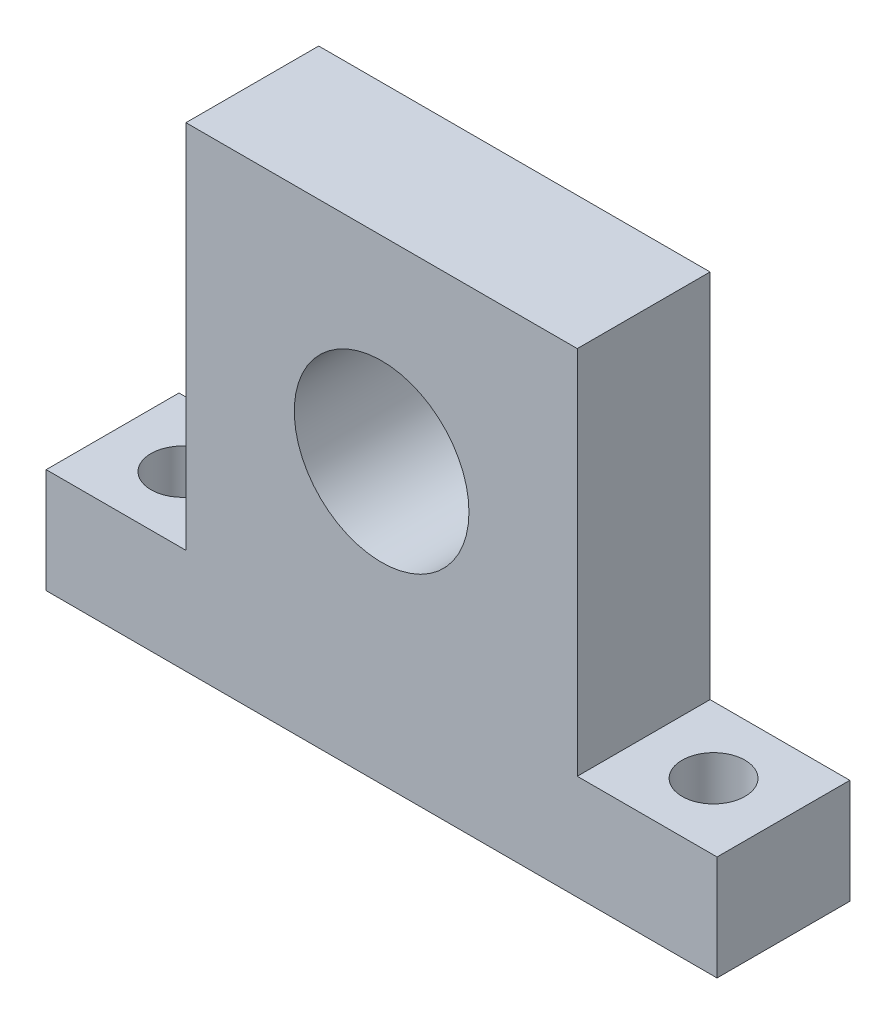
ISO-10303-21;
HEADER;
FILE_DESCRIPTION(('STEP AP214'),'2;1');
FILE_NAME('part.step','',(''),(''),'','','');
FILE_SCHEMA(('AUTOMOTIVE_DESIGN { 1 0 10303 214 1 1 1 1 }'));
ENDSEC;
DATA;
#1=APPLICATION_CONTEXT('core data for automotive mechanical design processes');
#2=APPLICATION_PROTOCOL_DEFINITION('international standard','automotive_design',2000,#1);
#3=PRODUCT_CONTEXT('',#1,'mechanical');
#4=PRODUCT('Part','Part','',(#3));
#5=PRODUCT_RELATED_PRODUCT_CATEGORY('part','',(#4));
#6=PRODUCT_DEFINITION_FORMATION('','',#4);
#7=PRODUCT_DEFINITION_CONTEXT('part definition',#1,'design');
#8=PRODUCT_DEFINITION('design','',#6,#7);
#9=PRODUCT_DEFINITION_SHAPE('','',#8);
#10=(LENGTH_UNIT() NAMED_UNIT(*) SI_UNIT(.MILLI.,.METRE.));
#11=(NAMED_UNIT(*) PLANE_ANGLE_UNIT() SI_UNIT($,.RADIAN.));
#12=(NAMED_UNIT(*) SI_UNIT($,.STERADIAN.) SOLID_ANGLE_UNIT());
#13=UNCERTAINTY_MEASURE_WITH_UNIT(LENGTH_MEASURE(1.E-05),#10,'distance_accuracy_value','');
#14=(GEOMETRIC_REPRESENTATION_CONTEXT(3) GLOBAL_UNCERTAINTY_ASSIGNED_CONTEXT((#13)) GLOBAL_UNIT_ASSIGNED_CONTEXT((#10,
#11,#12)) REPRESENTATION_CONTEXT('',''));
#15=CARTESIAN_POINT('',(0.,0.,0.));
#16=DIRECTION('',(0.,0.,1.));
#17=DIRECTION('',(1.,0.,0.));
#18=AXIS2_PLACEMENT_3D('',#15,#16,#17);
#19=CARTESIAN_POINT('',(0.,0.,19.));
#20=DIRECTION('',(0.,0.,1.));
#21=DIRECTION('',(1.,0.,0.));
#22=AXIS2_PLACEMENT_3D('',#19,#20,#21);
#23=PLANE('',#22);
#24=DIRECTION('',(1.,0.,0.));
#25=VECTOR('',#24,1.);
#26=CARTESIAN_POINT('',(-48.,-40.,19.));
#27=LINE('',#26,#25);
#28=CARTESIAN_POINT('',(-48.,-40.,19.));
#29=VERTEX_POINT('',#28);
#30=CARTESIAN_POINT('',(48.,-40.,19.));
#31=VERTEX_POINT('',#30);
#32=EDGE_CURVE('E168',#29,#31,#27,.T.);
#33=ORIENTED_EDGE('',*,*,#32,.T.);
#34=DIRECTION('',(0.,1.,0.));
#35=VECTOR('',#34,1.);
#36=CARTESIAN_POINT('',(48.,-40.,19.));
#37=LINE('',#36,#35);
#38=CARTESIAN_POINT('',(48.,-25.,19.));
#39=VERTEX_POINT('',#38);
#40=EDGE_CURVE('E104',#31,#39,#37,.T.);
#41=ORIENTED_EDGE('',*,*,#40,.T.);
#42=DIRECTION('',(-1.,0.,0.));
#43=VECTOR('',#42,1.);
#44=CARTESIAN_POINT('',(48.,-25.,19.));
#45=LINE('',#44,#43);
#46=CARTESIAN_POINT('',(28.,-25.,19.));
#47=VERTEX_POINT('',#46);
#48=EDGE_CURVE('E189',#39,#47,#45,.T.);
#49=ORIENTED_EDGE('',*,*,#48,.T.);
#50=DIRECTION('',(0.,1.,0.));
#51=VECTOR('',#50,1.);
#52=CARTESIAN_POINT('',(28.,-25.,19.));
#53=LINE('',#52,#51);
#54=CARTESIAN_POINT('',(28.,28.,19.));
#55=VERTEX_POINT('',#54);
#56=EDGE_CURVE('E203',#47,#55,#53,.T.);
#57=ORIENTED_EDGE('',*,*,#56,.T.);
#58=DIRECTION('',(-1.,0.,0.));
#59=VECTOR('',#58,1.);
#60=CARTESIAN_POINT('',(-28.,28.,19.));
#61=LINE('',#60,#59);
#62=CARTESIAN_POINT('',(-28.,28.,19.));
#63=VERTEX_POINT('',#62);
#64=EDGE_CURVE('E123',#55,#63,#61,.T.);
#65=ORIENTED_EDGE('',*,*,#64,.T.);
#66=DIRECTION('',(0.,-1.,0.));
#67=VECTOR('',#66,1.);
#68=CARTESIAN_POINT('',(-28.,-25.,19.));
#69=LINE('',#68,#67);
#70=CARTESIAN_POINT('',(-28.,-25.,19.));
#71=VERTEX_POINT('',#70);
#72=EDGE_CURVE('E117',#63,#71,#69,.T.);
#73=ORIENTED_EDGE('',*,*,#72,.T.);
#74=DIRECTION('',(-1.,0.,0.));
#75=VECTOR('',#74,1.);
#76=CARTESIAN_POINT('',(-48.,-25.,19.));
#77=LINE('',#76,#75);
#78=CARTESIAN_POINT('',(-48.,-25.,19.));
#79=VERTEX_POINT('',#78);
#80=EDGE_CURVE('E121',#71,#79,#77,.T.);
#81=ORIENTED_EDGE('',*,*,#80,.T.);
#82=DIRECTION('',(0.,-1.,0.));
#83=VECTOR('',#82,1.);
#84=CARTESIAN_POINT('',(-48.,-40.,19.));
#85=LINE('',#84,#83);
#86=EDGE_CURVE('E61',#79,#29,#85,.T.);
#87=ORIENTED_EDGE('',*,*,#86,.T.);
#88=EDGE_LOOP('',(#33,#41,#49,#57,#65,#73,#81,#87));
#89=FACE_BOUND('',#88,.T.);
#90=CARTESIAN_POINT('',(0.,0.,19.));
#91=DIRECTION('',(0.,0.,1.));
#92=DIRECTION('',(1.,0.,0.));
#93=AXIS2_PLACEMENT_3D('',#90,#91,#92);
#94=CIRCLE('',#93,12.5);
#95=CARTESIAN_POINT('',(12.5,0.,19.));
#96=VERTEX_POINT('',#95);
#97=EDGE_CURVE('E150',#96,#96,#94,.T.);
#98=ORIENTED_EDGE('',*,*,#97,.F.);
#99=EDGE_LOOP('',(#98));
#100=FACE_BOUND('',#99,.T.);
#101=ADVANCED_FACE('F43',(#89,#100),#23,.T.);
#102=CARTESIAN_POINT('',(0.,0.,0.));
#103=DIRECTION('',(0.,0.,1.));
#104=DIRECTION('',(1.,0.,0.));
#105=AXIS2_PLACEMENT_3D('',#102,#103,#104);
#106=PLANE('',#105);
#107=DIRECTION('',(1.,0.,0.));
#108=VECTOR('',#107,1.);
#109=CARTESIAN_POINT('',(-48.,-40.,0.));
#110=LINE('',#109,#108);
#111=CARTESIAN_POINT('',(-48.,-40.,0.));
#112=VERTEX_POINT('',#111);
#113=CARTESIAN_POINT('',(48.,-40.,0.));
#114=VERTEX_POINT('',#113);
#115=EDGE_CURVE('E145',#112,#114,#110,.T.);
#116=ORIENTED_EDGE('',*,*,#115,.F.);
#117=DIRECTION('',(0.,-1.,0.));
#118=VECTOR('',#117,1.);
#119=CARTESIAN_POINT('',(-48.,-40.,0.));
#120=LINE('',#119,#118);
#121=CARTESIAN_POINT('',(-48.,-25.,0.));
#122=VERTEX_POINT('',#121);
#123=EDGE_CURVE('E96',#122,#112,#120,.T.);
#124=ORIENTED_EDGE('',*,*,#123,.F.);
#125=DIRECTION('',(-1.,0.,0.));
#126=VECTOR('',#125,1.);
#127=CARTESIAN_POINT('',(-48.,-25.,0.));
#128=LINE('',#127,#126);
#129=CARTESIAN_POINT('',(-28.,-25.,0.));
#130=VERTEX_POINT('',#129);
#131=EDGE_CURVE('E90',#130,#122,#128,.T.);
#132=ORIENTED_EDGE('',*,*,#131,.F.);
#133=DIRECTION('',(0.,-1.,0.));
#134=VECTOR('',#133,1.);
#135=CARTESIAN_POINT('',(-28.,-25.,0.));
#136=LINE('',#135,#134);
#137=CARTESIAN_POINT('',(-28.,28.,0.));
#138=VERTEX_POINT('',#137);
#139=EDGE_CURVE('E132',#138,#130,#136,.T.);
#140=ORIENTED_EDGE('',*,*,#139,.F.);
#141=DIRECTION('',(-1.,0.,0.));
#142=VECTOR('',#141,1.);
#143=CARTESIAN_POINT('',(-28.,28.,0.));
#144=LINE('',#143,#142);
#145=CARTESIAN_POINT('',(28.,28.,0.));
#146=VERTEX_POINT('',#145);
#147=EDGE_CURVE('E159',#146,#138,#144,.T.);
#148=ORIENTED_EDGE('',*,*,#147,.F.);
#149=DIRECTION('',(0.,1.,0.));
#150=VECTOR('',#149,1.);
#151=CARTESIAN_POINT('',(28.,-25.,0.));
#152=LINE('',#151,#150);
#153=CARTESIAN_POINT('',(28.,-25.,0.));
#154=VERTEX_POINT('',#153);
#155=EDGE_CURVE('E156',#154,#146,#152,.T.);
#156=ORIENTED_EDGE('',*,*,#155,.F.);
#157=DIRECTION('',(-1.,0.,0.));
#158=VECTOR('',#157,1.);
#159=CARTESIAN_POINT('',(48.,-25.,0.));
#160=LINE('',#159,#158);
#161=CARTESIAN_POINT('',(48.,-25.,0.));
#162=VERTEX_POINT('',#161);
#163=EDGE_CURVE('E153',#162,#154,#160,.T.);
#164=ORIENTED_EDGE('',*,*,#163,.F.);
#165=DIRECTION('',(0.,1.,0.));
#166=VECTOR('',#165,1.);
#167=CARTESIAN_POINT('',(48.,-40.,0.));
#168=LINE('',#167,#166);
#169=EDGE_CURVE('E149',#114,#162,#168,.T.);
#170=ORIENTED_EDGE('',*,*,#169,.F.);
#171=EDGE_LOOP('',(#116,#124,#132,#140,#148,#156,#164,#170));
#172=FACE_BOUND('',#171,.T.);
#173=CARTESIAN_POINT('',(0.,0.,0.));
#174=DIRECTION('',(0.,0.,1.));
#175=DIRECTION('',(1.,0.,0.));
#176=AXIS2_PLACEMENT_3D('',#173,#174,#175);
#177=CIRCLE('',#176,12.5);
#178=CARTESIAN_POINT('',(12.5,0.,0.));
#179=VERTEX_POINT('',#178);
#180=EDGE_CURVE('E213',#179,#179,#177,.T.);
#181=ORIENTED_EDGE('',*,*,#180,.T.);
#182=EDGE_LOOP('',(#181));
#183=FACE_BOUND('',#182,.T.);
#184=ADVANCED_FACE('F193',(#172,#183),#106,.F.);
#185=CARTESIAN_POINT('',(-48.,-40.,19.));
#186=DIRECTION('',(0.,1.,0.));
#187=DIRECTION('',(0.,0.,1.));
#188=AXIS2_PLACEMENT_3D('',#185,#186,#187);
#189=PLANE('',#188);
#190=CARTESIAN_POINT('',(-38.,-40.,9.5));
#191=DIRECTION('',(0.,1.,0.));
#192=DIRECTION('',(0.,0.,1.));
#193=AXIS2_PLACEMENT_3D('',#190,#191,#192);
#194=CIRCLE('',#193,4.5);
#195=CARTESIAN_POINT('',(-38.,-40.,14.));
#196=VERTEX_POINT('',#195);
#197=EDGE_CURVE('E217',#196,#196,#194,.T.);
#198=ORIENTED_EDGE('',*,*,#197,.T.);
#199=EDGE_LOOP('',(#198));
#200=FACE_BOUND('',#199,.T.);
#201=CARTESIAN_POINT('',(38.,-40.,9.50000000000002));
#202=DIRECTION('',(0.,1.,0.));
#203=DIRECTION('',(0.,0.,-1.));
#204=AXIS2_PLACEMENT_3D('',#201,#202,#203);
#205=CIRCLE('',#204,4.5);
#206=CARTESIAN_POINT('',(38.,-40.,5.00000000000002));
#207=VERTEX_POINT('',#206);
#208=EDGE_CURVE('E221',#207,#207,#205,.T.);
#209=ORIENTED_EDGE('',*,*,#208,.T.);
#210=EDGE_LOOP('',(#209));
#211=FACE_BOUND('',#210,.T.);
#212=ORIENTED_EDGE('',*,*,#115,.T.);
#213=DIRECTION('',(0.,0.,-1.));
#214=VECTOR('',#213,1.);
#215=CARTESIAN_POINT('',(48.,-40.,19.));
#216=LINE('',#215,#214);
#217=EDGE_CURVE('E11',#31,#114,#216,.T.);
#218=ORIENTED_EDGE('',*,*,#217,.F.);
#219=ORIENTED_EDGE('',*,*,#32,.F.);
#220=DIRECTION('',(0.,0.,-1.));
#221=VECTOR('',#220,1.);
#222=CARTESIAN_POINT('',(-48.,-40.,19.));
#223=LINE('',#222,#221);
#224=EDGE_CURVE('E141',#29,#112,#223,.T.);
#225=ORIENTED_EDGE('',*,*,#224,.T.);
#226=EDGE_LOOP('',(#212,#218,#219,#225));
#227=FACE_BOUND('',#226,.T.);
#228=ADVANCED_FACE('F45',(#200,#211,#227),#189,.F.);
#229=CARTESIAN_POINT('',(48.,-40.,19.));
#230=DIRECTION('',(-1.,0.,0.));
#231=DIRECTION('',(0.,0.,1.));
#232=AXIS2_PLACEMENT_3D('',#229,#230,#231);
#233=PLANE('',#232);
#234=ORIENTED_EDGE('',*,*,#169,.T.);
#235=DIRECTION('',(0.,0.,-1.));
#236=VECTOR('',#235,1.);
#237=CARTESIAN_POINT('',(48.,-25.,19.));
#238=LINE('',#237,#236);
#239=EDGE_CURVE('E53',#39,#162,#238,.T.);
#240=ORIENTED_EDGE('',*,*,#239,.F.);
#241=ORIENTED_EDGE('',*,*,#40,.F.);
#242=ORIENTED_EDGE('',*,*,#217,.T.);
#243=EDGE_LOOP('',(#234,#240,#241,#242));
#244=FACE_BOUND('',#243,.T.);
#245=ADVANCED_FACE('F275',(#244),#233,.F.);
#246=CARTESIAN_POINT('',(48.,-25.,19.));
#247=DIRECTION('',(0.,-1.,0.));
#248=DIRECTION('',(0.,0.,-1.));
#249=AXIS2_PLACEMENT_3D('',#246,#247,#248);
#250=PLANE('',#249);
#251=CARTESIAN_POINT('',(38.,-25.,9.50000000000002));
#252=DIRECTION('',(0.,1.,0.));
#253=DIRECTION('',(0.,0.,-1.));
#254=AXIS2_PLACEMENT_3D('',#251,#252,#253);
#255=CIRCLE('',#254,4.5);
#256=CARTESIAN_POINT('',(38.,-25.,5.00000000000002));
#257=VERTEX_POINT('',#256);
#258=EDGE_CURVE('E225',#257,#257,#255,.T.);
#259=ORIENTED_EDGE('',*,*,#258,.F.);
#260=EDGE_LOOP('',(#259));
#261=FACE_BOUND('',#260,.T.);
#262=ORIENTED_EDGE('',*,*,#163,.T.);
#263=DIRECTION('',(0.,0.,-1.));
#264=VECTOR('',#263,1.);
#265=CARTESIAN_POINT('',(28.,-25.,19.));
#266=LINE('',#265,#264);
#267=EDGE_CURVE('E179',#47,#154,#266,.T.);
#268=ORIENTED_EDGE('',*,*,#267,.F.);
#269=ORIENTED_EDGE('',*,*,#48,.F.);
#270=ORIENTED_EDGE('',*,*,#239,.T.);
#271=EDGE_LOOP('',(#262,#268,#269,#270));
#272=FACE_BOUND('',#271,.T.);
#273=ADVANCED_FACE('F187',(#261,#272),#250,.F.);
#274=CARTESIAN_POINT('',(28.,-25.,19.));
#275=DIRECTION('',(-1.,0.,0.));
#276=DIRECTION('',(0.,0.,1.));
#277=AXIS2_PLACEMENT_3D('',#274,#275,#276);
#278=PLANE('',#277);
#279=ORIENTED_EDGE('',*,*,#155,.T.);
#280=DIRECTION('',(0.,0.,-1.));
#281=VECTOR('',#280,1.);
#282=CARTESIAN_POINT('',(28.,28.,19.));
#283=LINE('',#282,#281);
#284=EDGE_CURVE('E175',#55,#146,#283,.T.);
#285=ORIENTED_EDGE('',*,*,#284,.F.);
#286=ORIENTED_EDGE('',*,*,#56,.F.);
#287=ORIENTED_EDGE('',*,*,#267,.T.);
#288=EDGE_LOOP('',(#279,#285,#286,#287));
#289=FACE_BOUND('',#288,.T.);
#290=ADVANCED_FACE('F198',(#289),#278,.F.);
#291=CARTESIAN_POINT('',(-28.,28.,19.));
#292=DIRECTION('',(0.,-1.,0.));
#293=DIRECTION('',(0.,0.,-1.));
#294=AXIS2_PLACEMENT_3D('',#291,#292,#293);
#295=PLANE('',#294);
#296=ORIENTED_EDGE('',*,*,#147,.T.);
#297=DIRECTION('',(0.,0.,-1.));
#298=VECTOR('',#297,1.);
#299=CARTESIAN_POINT('',(-28.,28.,19.));
#300=LINE('',#299,#298);
#301=EDGE_CURVE('E134',#63,#138,#300,.T.);
#302=ORIENTED_EDGE('',*,*,#301,.F.);
#303=ORIENTED_EDGE('',*,*,#64,.F.);
#304=ORIENTED_EDGE('',*,*,#284,.T.);
#305=EDGE_LOOP('',(#296,#302,#303,#304));
#306=FACE_BOUND('',#305,.T.);
#307=ADVANCED_FACE('F201',(#306),#295,.F.);
#308=CARTESIAN_POINT('',(-28.,-25.,19.));
#309=DIRECTION('',(1.,0.,0.));
#310=DIRECTION('',(0.,0.,-1.));
#311=AXIS2_PLACEMENT_3D('',#308,#309,#310);
#312=PLANE('',#311);
#313=ORIENTED_EDGE('',*,*,#139,.T.);
#314=DIRECTION('',(0.,0.,-1.));
#315=VECTOR('',#314,1.);
#316=CARTESIAN_POINT('',(-28.,-25.,19.));
#317=LINE('',#316,#315);
#318=EDGE_CURVE('E129',#71,#130,#317,.T.);
#319=ORIENTED_EDGE('',*,*,#318,.F.);
#320=ORIENTED_EDGE('',*,*,#72,.F.);
#321=ORIENTED_EDGE('',*,*,#301,.T.);
#322=EDGE_LOOP('',(#313,#319,#320,#321));
#323=FACE_BOUND('',#322,.T.);
#324=ADVANCED_FACE('F130',(#323),#312,.F.);
#325=CARTESIAN_POINT('',(-48.,-25.,19.));
#326=DIRECTION('',(0.,-1.,0.));
#327=DIRECTION('',(0.,0.,-1.));
#328=AXIS2_PLACEMENT_3D('',#325,#326,#327);
#329=PLANE('',#328);
#330=CARTESIAN_POINT('',(-38.,-25.,9.5));
#331=DIRECTION('',(0.,1.,0.));
#332=DIRECTION('',(0.,0.,1.));
#333=AXIS2_PLACEMENT_3D('',#330,#331,#332);
#334=CIRCLE('',#333,4.5);
#335=CARTESIAN_POINT('',(-38.,-25.,14.));
#336=VERTEX_POINT('',#335);
#337=EDGE_CURVE('E229',#336,#336,#334,.T.);
#338=ORIENTED_EDGE('',*,*,#337,.F.);
#339=EDGE_LOOP('',(#338));
#340=FACE_BOUND('',#339,.T.);
#341=ORIENTED_EDGE('',*,*,#131,.T.);
#342=DIRECTION('',(0.,0.,-1.));
#343=VECTOR('',#342,1.);
#344=CARTESIAN_POINT('',(-48.,-25.,19.));
#345=LINE('',#344,#343);
#346=EDGE_CURVE('E135',#79,#122,#345,.T.);
#347=ORIENTED_EDGE('',*,*,#346,.F.);
#348=ORIENTED_EDGE('',*,*,#80,.F.);
#349=ORIENTED_EDGE('',*,*,#318,.T.);
#350=EDGE_LOOP('',(#341,#347,#348,#349));
#351=FACE_BOUND('',#350,.T.);
#352=ADVANCED_FACE('F137',(#340,#351),#329,.F.);
#353=CARTESIAN_POINT('',(-48.,-40.,19.));
#354=DIRECTION('',(1.,0.,0.));
#355=DIRECTION('',(0.,0.,-1.));
#356=AXIS2_PLACEMENT_3D('',#353,#354,#355);
#357=PLANE('',#356);
#358=ORIENTED_EDGE('',*,*,#123,.T.);
#359=ORIENTED_EDGE('',*,*,#224,.F.);
#360=ORIENTED_EDGE('',*,*,#86,.F.);
#361=ORIENTED_EDGE('',*,*,#346,.T.);
#362=EDGE_LOOP('',(#358,#359,#360,#361));
#363=FACE_BOUND('',#362,.T.);
#364=ADVANCED_FACE('F248',(#363),#357,.F.);
#365=CARTESIAN_POINT('',(0.,0.,19.));
#366=DIRECTION('',(0.,0.,-1.));
#367=DIRECTION('',(-1.,0.,0.));
#368=AXIS2_PLACEMENT_3D('',#365,#366,#367);
#369=CYLINDRICAL_SURFACE('',#368,12.5);
#370=ORIENTED_EDGE('',*,*,#97,.T.);
#371=EDGE_LOOP('',(#370));
#372=FACE_BOUND('',#371,.T.);
#373=ORIENTED_EDGE('',*,*,#180,.F.);
#374=EDGE_LOOP('',(#373));
#375=FACE_BOUND('',#374,.T.);
#376=ADVANCED_FACE('F243',(#372,#375),#369,.F.);
#377=CARTESIAN_POINT('',(-38.,-40.,9.5));
#378=DIRECTION('',(0.,1.,0.));
#379=DIRECTION('',(0.,0.,1.));
#380=AXIS2_PLACEMENT_3D('',#377,#378,#379);
#381=CYLINDRICAL_SURFACE('',#380,4.5);
#382=ORIENTED_EDGE('',*,*,#197,.F.);
#383=EDGE_LOOP('',(#382));
#384=FACE_BOUND('',#383,.T.);
#385=ORIENTED_EDGE('',*,*,#337,.T.);
#386=EDGE_LOOP('',(#385));
#387=FACE_BOUND('',#386,.T.);
#388=ADVANCED_FACE('F239',(#384,#387),#381,.F.);
#389=CARTESIAN_POINT('',(38.,-40.,9.50000000000002));
#390=DIRECTION('',(0.,1.,0.));
#391=DIRECTION('',(0.,0.,1.));
#392=AXIS2_PLACEMENT_3D('',#389,#390,#391);
#393=CYLINDRICAL_SURFACE('',#392,4.5);
#394=ORIENTED_EDGE('',*,*,#208,.F.);
#395=EDGE_LOOP('',(#394));
#396=FACE_BOUND('',#395,.T.);
#397=ORIENTED_EDGE('',*,*,#258,.T.);
#398=EDGE_LOOP('',(#397));
#399=FACE_BOUND('',#398,.T.);
#400=ADVANCED_FACE('F242',(#396,#399),#393,.F.);
#401=CLOSED_SHELL('',(#101,#184,#228,#245,#273,#290,#307,#324,#352,#364,#376,#388,#400));
#402=MANIFOLD_SOLID_BREP('B2',#401);
#403=ADVANCED_BREP_SHAPE_REPRESENTATION('',(#18,#402),#14);
#404=SHAPE_DEFINITION_REPRESENTATION(#9,#403);
ENDSEC;
END-ISO-10303-21;
